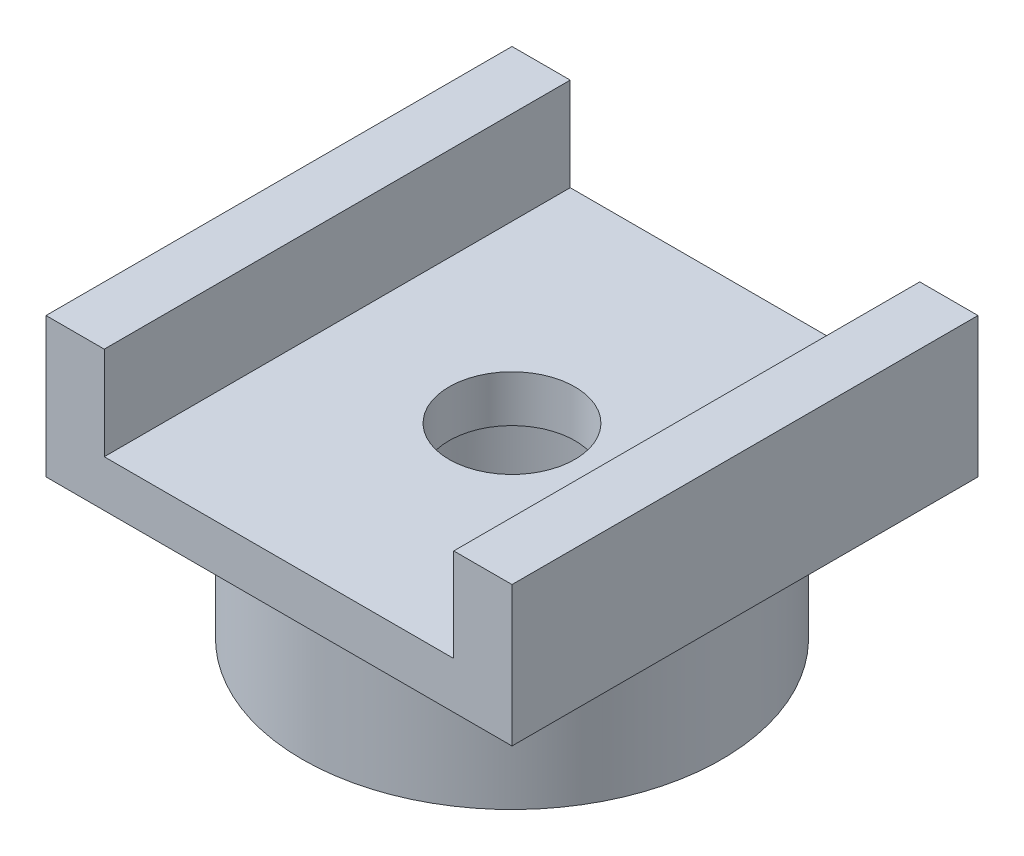
ISO-10303-21;
HEADER;
FILE_DESCRIPTION(('STEP AP214'),'2;1');
FILE_NAME('part.step','',(''),(''),'','','');
FILE_SCHEMA(('AUTOMOTIVE_DESIGN { 1 0 10303 214 1 1 1 1 }'));
ENDSEC;
DATA;
#1=APPLICATION_CONTEXT('core data for automotive mechanical design processes');
#2=APPLICATION_PROTOCOL_DEFINITION('international standard','automotive_design',2000,#1);
#3=PRODUCT_CONTEXT('',#1,'mechanical');
#4=PRODUCT('Part','Part','',(#3));
#5=PRODUCT_RELATED_PRODUCT_CATEGORY('part','',(#4));
#6=PRODUCT_DEFINITION_FORMATION('','',#4);
#7=PRODUCT_DEFINITION_CONTEXT('part definition',#1,'design');
#8=PRODUCT_DEFINITION('design','',#6,#7);
#9=PRODUCT_DEFINITION_SHAPE('','',#8);
#10=(LENGTH_UNIT() NAMED_UNIT(*) SI_UNIT(.MILLI.,.METRE.));
#11=(NAMED_UNIT(*) PLANE_ANGLE_UNIT() SI_UNIT($,.RADIAN.));
#12=(NAMED_UNIT(*) SI_UNIT($,.STERADIAN.) SOLID_ANGLE_UNIT());
#13=UNCERTAINTY_MEASURE_WITH_UNIT(LENGTH_MEASURE(1.E-05),#10,'distance_accuracy_value','');
#14=(GEOMETRIC_REPRESENTATION_CONTEXT(3) GLOBAL_UNCERTAINTY_ASSIGNED_CONTEXT((#13)) GLOBAL_UNIT_ASSIGNED_CONTEXT((#10,
#11,#12)) REPRESENTATION_CONTEXT('',''));
#15=CARTESIAN_POINT('',(0.,0.,0.));
#16=DIRECTION('',(0.,0.,1.));
#17=DIRECTION('',(1.,0.,0.));
#18=AXIS2_PLACEMENT_3D('',#15,#16,#17);
#19=CARTESIAN_POINT('',(0.,1.,0.));
#20=DIRECTION('',(0.,-1.,0.));
#21=DIRECTION('',(0.,0.,-1.));
#22=AXIS2_PLACEMENT_3D('',#19,#20,#21);
#23=PLANE('',#22);
#24=CARTESIAN_POINT('',(0.,1.,0.));
#25=DIRECTION('',(0.,1.,0.));
#26=DIRECTION('',(0.,0.,1.));
#27=AXIS2_PLACEMENT_3D('',#24,#25,#26);
#28=CIRCLE('',#27,1.35);
#29=CARTESIAN_POINT('',(0.,1.,1.35));
#30=VERTEX_POINT('',#29);
#31=EDGE_CURVE('E148',#30,#30,#28,.T.);
#32=ORIENTED_EDGE('',*,*,#31,.F.);
#33=EDGE_LOOP('',(#32));
#34=FACE_BOUND('',#33,.T.);
#35=DIRECTION('',(0.,0.,1.));
#36=VECTOR('',#35,1.);
#37=CARTESIAN_POINT('',(3.75,1.,5.));
#38=LINE('',#37,#36);
#39=CARTESIAN_POINT('',(3.75,1.,-5.));
#40=VERTEX_POINT('',#39);
#41=CARTESIAN_POINT('',(3.75,1.,5.));
#42=VERTEX_POINT('',#41);
#43=EDGE_CURVE('E51',#40,#42,#38,.T.);
#44=ORIENTED_EDGE('',*,*,#43,.F.);
#45=DIRECTION('',(-1.,0.,0.));
#46=VECTOR('',#45,1.);
#47=CARTESIAN_POINT('',(-5.,1.,-5.));
#48=LINE('',#47,#46);
#49=CARTESIAN_POINT('',(-3.75,1.,-5.));
#50=VERTEX_POINT('',#49);
#51=EDGE_CURVE('E37',#40,#50,#48,.T.);
#52=ORIENTED_EDGE('',*,*,#51,.T.);
#53=DIRECTION('',(0.,0.,-1.));
#54=VECTOR('',#53,1.);
#55=CARTESIAN_POINT('',(-3.75,1.,-5.));
#56=LINE('',#55,#54);
#57=CARTESIAN_POINT('',(-3.75,1.,5.));
#58=VERTEX_POINT('',#57);
#59=EDGE_CURVE('E134',#58,#50,#56,.T.);
#60=ORIENTED_EDGE('',*,*,#59,.F.);
#61=DIRECTION('',(1.,0.,0.));
#62=VECTOR('',#61,1.);
#63=CARTESIAN_POINT('',(-5.,1.,5.));
#64=LINE('',#63,#62);
#65=EDGE_CURVE('E56',#58,#42,#64,.T.);
#66=ORIENTED_EDGE('',*,*,#65,.T.);
#67=EDGE_LOOP('',(#44,#52,#60,#66));
#68=FACE_BOUND('',#67,.T.);
#69=ADVANCED_FACE('F33',(#34,#68),#23,.F.);
#70=CARTESIAN_POINT('',(0.,-3.,0.));
#71=DIRECTION('',(0.,1.,0.));
#72=DIRECTION('',(0.,0.,1.));
#73=AXIS2_PLACEMENT_3D('',#70,#71,#72);
#74=CYLINDRICAL_SURFACE('',#73,4.5);
#75=CARTESIAN_POINT('',(0.,-3.,0.));
#76=DIRECTION('',(0.,1.,0.));
#77=DIRECTION('',(0.,0.,1.));
#78=AXIS2_PLACEMENT_3D('',#75,#76,#77);
#79=CIRCLE('',#78,4.5);
#80=CARTESIAN_POINT('',(0.,-3.,4.5));
#81=VERTEX_POINT('',#80);
#82=EDGE_CURVE('E11',#81,#81,#79,.T.);
#83=ORIENTED_EDGE('',*,*,#82,.T.);
#84=EDGE_LOOP('',(#83));
#85=FACE_BOUND('',#84,.T.);
#86=CARTESIAN_POINT('',(0.,0.,0.));
#87=DIRECTION('',(0.,1.,0.));
#88=DIRECTION('',(0.,0.,1.));
#89=AXIS2_PLACEMENT_3D('',#86,#87,#88);
#90=CIRCLE('',#89,4.5);
#91=CARTESIAN_POINT('',(0.,0.,4.5));
#92=VERTEX_POINT('',#91);
#93=EDGE_CURVE('E43',#92,#92,#90,.T.);
#94=ORIENTED_EDGE('',*,*,#93,.F.);
#95=EDGE_LOOP('',(#94));
#96=FACE_BOUND('',#95,.T.);
#97=ADVANCED_FACE('F35',(#85,#96),#74,.T.);
#98=CARTESIAN_POINT('',(0.,-3.,0.));
#99=DIRECTION('',(0.,1.,0.));
#100=DIRECTION('',(0.,0.,1.));
#101=AXIS2_PLACEMENT_3D('',#98,#99,#100);
#102=PLANE('',#101);
#103=CARTESIAN_POINT('',(0.,-3.,0.));
#104=DIRECTION('',(0.,1.,0.));
#105=DIRECTION('',(0.,0.,1.));
#106=AXIS2_PLACEMENT_3D('',#103,#104,#105);
#107=CIRCLE('',#106,2.75);
#108=CARTESIAN_POINT('',(0.,-3.,2.75));
#109=VERTEX_POINT('',#108);
#110=EDGE_CURVE('E190',#109,#109,#107,.T.);
#111=ORIENTED_EDGE('',*,*,#110,.T.);
#112=EDGE_LOOP('',(#111));
#113=FACE_BOUND('',#112,.T.);
#114=ORIENTED_EDGE('',*,*,#82,.F.);
#115=EDGE_LOOP('',(#114));
#116=FACE_BOUND('',#115,.T.);
#117=ADVANCED_FACE('F199',(#113,#116),#102,.F.);
#118=CARTESIAN_POINT('',(0.,-3.,0.));
#119=DIRECTION('',(0.,1.,0.));
#120=DIRECTION('',(0.,0.,1.));
#121=AXIS2_PLACEMENT_3D('',#118,#119,#120);
#122=CYLINDRICAL_SURFACE('',#121,2.75);
#123=ORIENTED_EDGE('',*,*,#110,.F.);
#124=EDGE_LOOP('',(#123));
#125=FACE_BOUND('',#124,.T.);
#126=CARTESIAN_POINT('',(0.,0.,0.));
#127=DIRECTION('',(0.,-1.,0.));
#128=DIRECTION('',(0.,0.,-1.));
#129=AXIS2_PLACEMENT_3D('',#126,#127,#128);
#130=CIRCLE('',#129,2.75);
#131=CARTESIAN_POINT('',(0.,0.,-2.75));
#132=VERTEX_POINT('',#131);
#133=EDGE_CURVE('E109',#132,#132,#130,.F.);
#134=ORIENTED_EDGE('',*,*,#133,.T.);
#135=EDGE_LOOP('',(#134));
#136=FACE_BOUND('',#135,.T.);
#137=ADVANCED_FACE('F205',(#125,#136),#122,.F.);
#138=CARTESIAN_POINT('',(0.,0.,0.));
#139=DIRECTION('',(0.,-1.,0.));
#140=DIRECTION('',(0.,0.,-1.));
#141=AXIS2_PLACEMENT_3D('',#138,#139,#140);
#142=PLANE('',#141);
#143=CARTESIAN_POINT('',(0.,0.,0.));
#144=DIRECTION('',(0.,1.,0.));
#145=DIRECTION('',(0.,0.,1.));
#146=AXIS2_PLACEMENT_3D('',#143,#144,#145);
#147=CIRCLE('',#146,1.35);
#148=CARTESIAN_POINT('',(0.,0.,1.35));
#149=VERTEX_POINT('',#148);
#150=EDGE_CURVE('E162',#149,#149,#147,.T.);
#151=ORIENTED_EDGE('',*,*,#150,.T.);
#152=EDGE_LOOP('',(#151));
#153=FACE_BOUND('',#152,.T.);
#154=ORIENTED_EDGE('',*,*,#133,.F.);
#155=EDGE_LOOP('',(#154));
#156=FACE_BOUND('',#155,.T.);
#157=ADVANCED_FACE('F220',(#153,#156),#142,.T.);
#158=ORIENTED_EDGE('',*,*,#93,.T.);
#159=EDGE_LOOP('',(#158));
#160=FACE_BOUND('',#159,.T.);
#161=DIRECTION('',(0.,0.,-1.));
#162=VECTOR('',#161,1.);
#163=CARTESIAN_POINT('',(5.,0.,5.));
#164=LINE('',#163,#162);
#165=CARTESIAN_POINT('',(5.,0.,5.));
#166=VERTEX_POINT('',#165);
#167=CARTESIAN_POINT('',(5.,0.,-5.));
#168=VERTEX_POINT('',#167);
#169=EDGE_CURVE('E107',#166,#168,#164,.T.);
#170=ORIENTED_EDGE('',*,*,#169,.F.);
#171=DIRECTION('',(1.,0.,0.));
#172=VECTOR('',#171,1.);
#173=CARTESIAN_POINT('',(-5.,0.,5.));
#174=LINE('',#173,#172);
#175=CARTESIAN_POINT('',(-5.,0.,5.));
#176=VERTEX_POINT('',#175);
#177=EDGE_CURVE('E179',#176,#166,#174,.T.);
#178=ORIENTED_EDGE('',*,*,#177,.F.);
#179=DIRECTION('',(0.,0.,1.));
#180=VECTOR('',#179,1.);
#181=CARTESIAN_POINT('',(-5.,0.,5.));
#182=LINE('',#181,#180);
#183=CARTESIAN_POINT('',(-5.,0.,-5.));
#184=VERTEX_POINT('',#183);
#185=EDGE_CURVE('E177',#184,#176,#182,.T.);
#186=ORIENTED_EDGE('',*,*,#185,.F.);
#187=DIRECTION('',(-1.,0.,0.));
#188=VECTOR('',#187,1.);
#189=CARTESIAN_POINT('',(-5.,0.,-5.));
#190=LINE('',#189,#188);
#191=EDGE_CURVE('E175',#168,#184,#190,.T.);
#192=ORIENTED_EDGE('',*,*,#191,.F.);
#193=EDGE_LOOP('',(#170,#178,#186,#192));
#194=FACE_BOUND('',#193,.T.);
#195=ADVANCED_FACE('F195',(#160,#194),#142,.T.);
#196=CARTESIAN_POINT('',(5.,1.,5.));
#197=DIRECTION('',(-1.,0.,0.));
#198=DIRECTION('',(0.,0.,1.));
#199=AXIS2_PLACEMENT_3D('',#196,#197,#198);
#200=PLANE('',#199);
#201=ORIENTED_EDGE('',*,*,#169,.T.);
#202=DIRECTION('',(0.,-1.,0.));
#203=VECTOR('',#202,1.);
#204=CARTESIAN_POINT('',(5.,1.,-5.));
#205=LINE('',#204,#203);
#206=CARTESIAN_POINT('',(5.,3.,-5.));
#207=VERTEX_POINT('',#206);
#208=EDGE_CURVE('E100',#207,#168,#205,.T.);
#209=ORIENTED_EDGE('',*,*,#208,.F.);
#210=DIRECTION('',(0.,0.,-1.));
#211=VECTOR('',#210,1.);
#212=CARTESIAN_POINT('',(5.,3.,5.));
#213=LINE('',#212,#211);
#214=CARTESIAN_POINT('',(5.,3.,5.));
#215=VERTEX_POINT('',#214);
#216=EDGE_CURVE('E105',#215,#207,#213,.T.);
#217=ORIENTED_EDGE('',*,*,#216,.F.);
#218=DIRECTION('',(0.,-1.,0.));
#219=VECTOR('',#218,1.);
#220=CARTESIAN_POINT('',(5.,1.,5.));
#221=LINE('',#220,#219);
#222=EDGE_CURVE('E181',#215,#166,#221,.T.);
#223=ORIENTED_EDGE('',*,*,#222,.T.);
#224=EDGE_LOOP('',(#201,#209,#217,#223));
#225=FACE_BOUND('',#224,.T.);
#226=ADVANCED_FACE('F102',(#225),#200,.F.);
#227=CARTESIAN_POINT('',(-5.,1.,-5.));
#228=DIRECTION('',(0.,0.,1.));
#229=DIRECTION('',(1.,0.,0.));
#230=AXIS2_PLACEMENT_3D('',#227,#228,#229);
#231=PLANE('',#230);
#232=ORIENTED_EDGE('',*,*,#191,.T.);
#233=DIRECTION('',(0.,-1.,0.));
#234=VECTOR('',#233,1.);
#235=CARTESIAN_POINT('',(-5.,1.,-5.));
#236=LINE('',#235,#234);
#237=CARTESIAN_POINT('',(-5.,3.,-5.));
#238=VERTEX_POINT('',#237);
#239=EDGE_CURVE('E110',#238,#184,#236,.T.);
#240=ORIENTED_EDGE('',*,*,#239,.F.);
#241=DIRECTION('',(-1.,0.,0.));
#242=VECTOR('',#241,1.);
#243=CARTESIAN_POINT('',(-5.,3.,-5.));
#244=LINE('',#243,#242);
#245=CARTESIAN_POINT('',(-3.75,3.,-5.));
#246=VERTEX_POINT('',#245);
#247=EDGE_CURVE('E142',#246,#238,#244,.T.);
#248=ORIENTED_EDGE('',*,*,#247,.F.);
#249=DIRECTION('',(0.,-1.,0.));
#250=VECTOR('',#249,1.);
#251=CARTESIAN_POINT('',(-3.75,3.,-5.));
#252=LINE('',#251,#250);
#253=EDGE_CURVE('E145',#246,#50,#252,.T.);
#254=ORIENTED_EDGE('',*,*,#253,.T.);
#255=ORIENTED_EDGE('',*,*,#51,.F.);
#256=DIRECTION('',(0.,-1.,0.));
#257=VECTOR('',#256,1.);
#258=CARTESIAN_POINT('',(3.75,3.,-5.));
#259=LINE('',#258,#257);
#260=CARTESIAN_POINT('',(3.75,3.,-5.));
#261=VERTEX_POINT('',#260);
#262=EDGE_CURVE('E116',#261,#40,#259,.T.);
#263=ORIENTED_EDGE('',*,*,#262,.F.);
#264=DIRECTION('',(-1.,0.,0.));
#265=VECTOR('',#264,1.);
#266=CARTESIAN_POINT('',(5.,3.,-5.));
#267=LINE('',#266,#265);
#268=EDGE_CURVE('E113',#207,#261,#267,.T.);
#269=ORIENTED_EDGE('',*,*,#268,.F.);
#270=ORIENTED_EDGE('',*,*,#208,.T.);
#271=EDGE_LOOP('',(#232,#240,#248,#254,#255,#263,#269,#270));
#272=FACE_BOUND('',#271,.T.);
#273=ADVANCED_FACE('F114',(#272),#231,.F.);
#274=CARTESIAN_POINT('',(-5.,1.,5.));
#275=DIRECTION('',(1.,0.,0.));
#276=DIRECTION('',(0.,0.,-1.));
#277=AXIS2_PLACEMENT_3D('',#274,#275,#276);
#278=PLANE('',#277);
#279=ORIENTED_EDGE('',*,*,#185,.T.);
#280=DIRECTION('',(0.,-1.,0.));
#281=VECTOR('',#280,1.);
#282=CARTESIAN_POINT('',(-5.,1.,5.));
#283=LINE('',#282,#281);
#284=CARTESIAN_POINT('',(-5.,3.,5.));
#285=VERTEX_POINT('',#284);
#286=EDGE_CURVE('E183',#285,#176,#283,.T.);
#287=ORIENTED_EDGE('',*,*,#286,.F.);
#288=DIRECTION('',(0.,0.,1.));
#289=VECTOR('',#288,1.);
#290=CARTESIAN_POINT('',(-5.,3.,-5.));
#291=LINE('',#290,#289);
#292=EDGE_CURVE('E135',#238,#285,#291,.T.);
#293=ORIENTED_EDGE('',*,*,#292,.F.);
#294=ORIENTED_EDGE('',*,*,#239,.T.);
#295=EDGE_LOOP('',(#279,#287,#293,#294));
#296=FACE_BOUND('',#295,.T.);
#297=ADVANCED_FACE('F224',(#296),#278,.F.);
#298=CARTESIAN_POINT('',(-5.,1.,5.));
#299=DIRECTION('',(0.,0.,-1.));
#300=DIRECTION('',(-1.,0.,0.));
#301=AXIS2_PLACEMENT_3D('',#298,#299,#300);
#302=PLANE('',#301);
#303=ORIENTED_EDGE('',*,*,#177,.T.);
#304=ORIENTED_EDGE('',*,*,#222,.F.);
#305=DIRECTION('',(1.,0.,0.));
#306=VECTOR('',#305,1.);
#307=CARTESIAN_POINT('',(5.,3.,5.));
#308=LINE('',#307,#306);
#309=CARTESIAN_POINT('',(3.75,3.,5.));
#310=VERTEX_POINT('',#309);
#311=EDGE_CURVE('E124',#310,#215,#308,.T.);
#312=ORIENTED_EDGE('',*,*,#311,.F.);
#313=DIRECTION('',(0.,-1.,0.));
#314=VECTOR('',#313,1.);
#315=CARTESIAN_POINT('',(3.75,3.,5.));
#316=LINE('',#315,#314);
#317=EDGE_CURVE('E129',#310,#42,#316,.T.);
#318=ORIENTED_EDGE('',*,*,#317,.T.);
#319=ORIENTED_EDGE('',*,*,#65,.F.);
#320=DIRECTION('',(0.,-1.,0.));
#321=VECTOR('',#320,1.);
#322=CARTESIAN_POINT('',(-3.75,3.,5.));
#323=LINE('',#322,#321);
#324=CARTESIAN_POINT('',(-3.75,3.,5.));
#325=VERTEX_POINT('',#324);
#326=EDGE_CURVE('E158',#325,#58,#323,.T.);
#327=ORIENTED_EDGE('',*,*,#326,.F.);
#328=DIRECTION('',(1.,0.,0.));
#329=VECTOR('',#328,1.);
#330=CARTESIAN_POINT('',(-5.,3.,5.));
#331=LINE('',#330,#329);
#332=EDGE_CURVE('E138',#285,#325,#331,.T.);
#333=ORIENTED_EDGE('',*,*,#332,.F.);
#334=ORIENTED_EDGE('',*,*,#286,.T.);
#335=EDGE_LOOP('',(#303,#304,#312,#318,#319,#327,#333,#334));
#336=FACE_BOUND('',#335,.T.);
#337=ADVANCED_FACE('F221',(#336),#302,.F.);
#338=CARTESIAN_POINT('',(0.,1.,0.));
#339=DIRECTION('',(0.,-1.,0.));
#340=DIRECTION('',(0.,0.,-1.));
#341=AXIS2_PLACEMENT_3D('',#338,#339,#340);
#342=CYLINDRICAL_SURFACE('',#341,1.35);
#343=ORIENTED_EDGE('',*,*,#31,.T.);
#344=EDGE_LOOP('',(#343));
#345=FACE_BOUND('',#344,.T.);
#346=ORIENTED_EDGE('',*,*,#150,.F.);
#347=EDGE_LOOP('',(#346));
#348=FACE_BOUND('',#347,.T.);
#349=ADVANCED_FACE('F216',(#345,#348),#342,.F.);
#350=CARTESIAN_POINT('',(-3.75,3.,-5.));
#351=DIRECTION('',(-1.,0.,0.));
#352=DIRECTION('',(0.,0.,1.));
#353=AXIS2_PLACEMENT_3D('',#350,#351,#352);
#354=PLANE('',#353);
#355=ORIENTED_EDGE('',*,*,#59,.T.);
#356=ORIENTED_EDGE('',*,*,#253,.F.);
#357=DIRECTION('',(0.,0.,-1.));
#358=VECTOR('',#357,1.);
#359=CARTESIAN_POINT('',(-3.75,3.,-5.));
#360=LINE('',#359,#358);
#361=EDGE_CURVE('E140',#325,#246,#360,.T.);
#362=ORIENTED_EDGE('',*,*,#361,.F.);
#363=ORIENTED_EDGE('',*,*,#326,.T.);
#364=EDGE_LOOP('',(#355,#356,#362,#363));
#365=FACE_BOUND('',#364,.T.);
#366=ADVANCED_FACE('F271',(#365),#354,.F.);
#367=CARTESIAN_POINT('',(0.,3.,0.));
#368=DIRECTION('',(0.,1.,0.));
#369=DIRECTION('',(0.,0.,1.));
#370=AXIS2_PLACEMENT_3D('',#367,#368,#369);
#371=PLANE('',#370);
#372=ORIENTED_EDGE('',*,*,#292,.T.);
#373=ORIENTED_EDGE('',*,*,#332,.T.);
#374=ORIENTED_EDGE('',*,*,#361,.T.);
#375=ORIENTED_EDGE('',*,*,#247,.T.);
#376=EDGE_LOOP('',(#372,#373,#374,#375));
#377=FACE_BOUND('',#376,.T.);
#378=ADVANCED_FACE('F277',(#377),#371,.T.);
#379=CARTESIAN_POINT('',(3.75,3.,5.));
#380=DIRECTION('',(1.,0.,0.));
#381=DIRECTION('',(0.,0.,-1.));
#382=AXIS2_PLACEMENT_3D('',#379,#380,#381);
#383=PLANE('',#382);
#384=ORIENTED_EDGE('',*,*,#43,.T.);
#385=ORIENTED_EDGE('',*,*,#317,.F.);
#386=DIRECTION('',(0.,0.,1.));
#387=VECTOR('',#386,1.);
#388=CARTESIAN_POINT('',(3.75,3.,5.));
#389=LINE('',#388,#387);
#390=EDGE_CURVE('E119',#261,#310,#389,.T.);
#391=ORIENTED_EDGE('',*,*,#390,.F.);
#392=ORIENTED_EDGE('',*,*,#262,.T.);
#393=EDGE_LOOP('',(#384,#385,#391,#392));
#394=FACE_BOUND('',#393,.T.);
#395=ADVANCED_FACE('F283',(#394),#383,.F.);
#396=CARTESIAN_POINT('',(0.,3.,0.));
#397=DIRECTION('',(0.,1.,0.));
#398=DIRECTION('',(0.,0.,1.));
#399=AXIS2_PLACEMENT_3D('',#396,#397,#398);
#400=PLANE('',#399);
#401=ORIENTED_EDGE('',*,*,#216,.T.);
#402=ORIENTED_EDGE('',*,*,#268,.T.);
#403=ORIENTED_EDGE('',*,*,#390,.T.);
#404=ORIENTED_EDGE('',*,*,#311,.T.);
#405=EDGE_LOOP('',(#401,#402,#403,#404));
#406=FACE_BOUND('',#405,.T.);
#407=ADVANCED_FACE('F122',(#406),#400,.T.);
#408=CLOSED_SHELL('',(#69,#97,#117,#137,#157,#195,#226,#273,#297,#337,#349,#366,#378,#395,#407));
#409=MANIFOLD_SOLID_BREP('B2',#408);
#410=ADVANCED_BREP_SHAPE_REPRESENTATION('',(#18,#409),#14);
#411=SHAPE_DEFINITION_REPRESENTATION(#9,#410);
ENDSEC;
END-ISO-10303-21;
